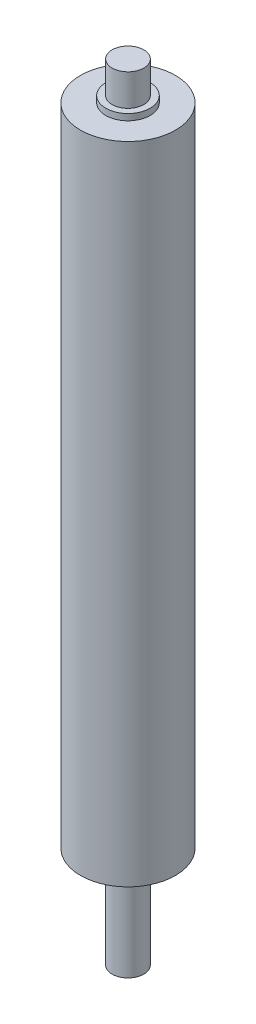
ISO-10303-21;
HEADER;
FILE_DESCRIPTION(('STEP AP214'),'2;1');
FILE_NAME('part.step','',(''),(''),'','','');
FILE_SCHEMA(('AUTOMOTIVE_DESIGN { 1 0 10303 214 1 1 1 1 }'));
ENDSEC;
DATA;
#1=APPLICATION_CONTEXT('core data for automotive mechanical design processes');
#2=APPLICATION_PROTOCOL_DEFINITION('international standard','automotive_design',2000,#1);
#3=PRODUCT_CONTEXT('',#1,'mechanical');
#4=PRODUCT('Part','Part','',(#3));
#5=PRODUCT_RELATED_PRODUCT_CATEGORY('part','',(#4));
#6=PRODUCT_DEFINITION_FORMATION('','',#4);
#7=PRODUCT_DEFINITION_CONTEXT('part definition',#1,'design');
#8=PRODUCT_DEFINITION('design','',#6,#7);
#9=PRODUCT_DEFINITION_SHAPE('','',#8);
#10=(LENGTH_UNIT() NAMED_UNIT(*) SI_UNIT(.MILLI.,.METRE.));
#11=(NAMED_UNIT(*) PLANE_ANGLE_UNIT() SI_UNIT($,.RADIAN.));
#12=(NAMED_UNIT(*) SI_UNIT($,.STERADIAN.) SOLID_ANGLE_UNIT());
#13=UNCERTAINTY_MEASURE_WITH_UNIT(LENGTH_MEASURE(1.E-05),#10,'distance_accuracy_value','');
#14=(GEOMETRIC_REPRESENTATION_CONTEXT(3) GLOBAL_UNCERTAINTY_ASSIGNED_CONTEXT((#13)) GLOBAL_UNIT_ASSIGNED_CONTEXT((#10,
#11,#12)) REPRESENTATION_CONTEXT('',''));
#15=CARTESIAN_POINT('',(0.,0.,0.));
#16=DIRECTION('',(0.,0.,1.));
#17=DIRECTION('',(1.,0.,0.));
#18=AXIS2_PLACEMENT_3D('',#15,#16,#17);
#19=CARTESIAN_POINT('',(0.,102.,0.));
#20=DIRECTION('',(0.,-1.,0.));
#21=DIRECTION('',(0.,0.,-1.));
#22=AXIS2_PLACEMENT_3D('',#19,#20,#21);
#23=CYLINDRICAL_SURFACE('',#22,7.5);
#24=CARTESIAN_POINT('',(0.,102.,0.));
#25=DIRECTION('',(0.,1.,0.));
#26=DIRECTION('',(0.,0.,1.));
#27=AXIS2_PLACEMENT_3D('',#24,#25,#26);
#28=CIRCLE('',#27,7.5);
#29=CARTESIAN_POINT('',(0.,102.,7.5));
#30=VERTEX_POINT('',#29);
#31=EDGE_CURVE('E65',#30,#30,#28,.T.);
#32=ORIENTED_EDGE('',*,*,#31,.F.);
#33=EDGE_LOOP('',(#32));
#34=FACE_BOUND('',#33,.T.);
#35=CARTESIAN_POINT('',(0.,0.,0.));
#36=DIRECTION('',(0.,1.,0.));
#37=DIRECTION('',(0.,0.,1.));
#38=AXIS2_PLACEMENT_3D('',#35,#36,#37);
#39=CIRCLE('',#38,7.5);
#40=CARTESIAN_POINT('',(0.,0.,7.5));
#41=VERTEX_POINT('',#40);
#42=EDGE_CURVE('E38',#41,#41,#39,.T.);
#43=ORIENTED_EDGE('',*,*,#42,.T.);
#44=EDGE_LOOP('',(#43));
#45=FACE_BOUND('',#44,.T.);
#46=ADVANCED_FACE('F35',(#34,#45),#23,.T.);
#47=CARTESIAN_POINT('',(0.,102.,0.));
#48=DIRECTION('',(0.,1.,0.));
#49=DIRECTION('',(0.,0.,1.));
#50=AXIS2_PLACEMENT_3D('',#47,#48,#49);
#51=PLANE('',#50);
#52=CARTESIAN_POINT('',(0.,102.,0.));
#53=DIRECTION('',(0.,1.,0.));
#54=DIRECTION('',(0.,0.,1.));
#55=AXIS2_PLACEMENT_3D('',#52,#53,#54);
#56=CIRCLE('',#55,3.5);
#57=CARTESIAN_POINT('',(0.,102.,3.5));
#58=VERTEX_POINT('',#57);
#59=EDGE_CURVE('E42',#58,#58,#56,.T.);
#60=ORIENTED_EDGE('',*,*,#59,.F.);
#61=EDGE_LOOP('',(#60));
#62=FACE_BOUND('',#61,.T.);
#63=ORIENTED_EDGE('',*,*,#31,.T.);
#64=EDGE_LOOP('',(#63));
#65=FACE_BOUND('',#64,.T.);
#66=ADVANCED_FACE('F76',(#62,#65),#51,.T.);
#67=CARTESIAN_POINT('',(0.,0.,0.));
#68=DIRECTION('',(0.,1.,0.));
#69=DIRECTION('',(0.,0.,1.));
#70=AXIS2_PLACEMENT_3D('',#67,#68,#69);
#71=PLANE('',#70);
#72=CARTESIAN_POINT('',(0.,0.,0.));
#73=DIRECTION('',(0.,-1.,0.));
#74=DIRECTION('',(0.,0.,-1.));
#75=AXIS2_PLACEMENT_3D('',#72,#73,#74);
#76=CIRCLE('',#75,3.5);
#77=CARTESIAN_POINT('',(0.,0.,-3.5));
#78=VERTEX_POINT('',#77);
#79=EDGE_CURVE('E61',#78,#78,#76,.T.);
#80=ORIENTED_EDGE('',*,*,#79,.F.);
#81=EDGE_LOOP('',(#80));
#82=FACE_BOUND('',#81,.T.);
#83=ORIENTED_EDGE('',*,*,#42,.F.);
#84=EDGE_LOOP('',(#83));
#85=FACE_BOUND('',#84,.T.);
#86=ADVANCED_FACE('F73',(#82,#85),#71,.F.);
#87=CARTESIAN_POINT('',(0.,-1.,0.));
#88=DIRECTION('',(0.,1.,0.));
#89=DIRECTION('',(0.,0.,1.));
#90=AXIS2_PLACEMENT_3D('',#87,#88,#89);
#91=CYLINDRICAL_SURFACE('',#90,3.5);
#92=CARTESIAN_POINT('',(0.,-1.,0.));
#93=DIRECTION('',(0.,-1.,0.));
#94=DIRECTION('',(0.,0.,-1.));
#95=AXIS2_PLACEMENT_3D('',#92,#93,#94);
#96=CIRCLE('',#95,3.5);
#97=CARTESIAN_POINT('',(0.,-1.,-3.5));
#98=VERTEX_POINT('',#97);
#99=EDGE_CURVE('E58',#98,#98,#96,.T.);
#100=ORIENTED_EDGE('',*,*,#99,.F.);
#101=EDGE_LOOP('',(#100));
#102=FACE_BOUND('',#101,.T.);
#103=ORIENTED_EDGE('',*,*,#79,.T.);
#104=EDGE_LOOP('',(#103));
#105=FACE_BOUND('',#104,.T.);
#106=ADVANCED_FACE('F75',(#102,#105),#91,.T.);
#107=CARTESIAN_POINT('',(0.,-1.,0.));
#108=DIRECTION('',(0.,-1.,0.));
#109=DIRECTION('',(0.,0.,-1.));
#110=AXIS2_PLACEMENT_3D('',#107,#108,#109);
#111=PLANE('',#110);
#112=CARTESIAN_POINT('',(0.,-1.,0.));
#113=DIRECTION('',(0.,-1.,0.));
#114=DIRECTION('',(0.,0.,-1.));
#115=AXIS2_PLACEMENT_3D('',#112,#113,#114);
#116=CIRCLE('',#115,2.5);
#117=CARTESIAN_POINT('',(0.,-1.,-2.5));
#118=VERTEX_POINT('',#117);
#119=EDGE_CURVE('E47',#118,#118,#116,.T.);
#120=ORIENTED_EDGE('',*,*,#119,.F.);
#121=EDGE_LOOP('',(#120));
#122=FACE_BOUND('',#121,.T.);
#123=ORIENTED_EDGE('',*,*,#99,.T.);
#124=EDGE_LOOP('',(#123));
#125=FACE_BOUND('',#124,.T.);
#126=ADVANCED_FACE('F82',(#122,#125),#111,.T.);
#127=CARTESIAN_POINT('',(0.,-16.,0.));
#128=DIRECTION('',(0.,1.,0.));
#129=DIRECTION('',(0.,0.,1.));
#130=AXIS2_PLACEMENT_3D('',#127,#128,#129);
#131=CYLINDRICAL_SURFACE('',#130,2.5);
#132=CARTESIAN_POINT('',(0.,-16.,0.));
#133=DIRECTION('',(0.,-1.,0.));
#134=DIRECTION('',(0.,0.,-1.));
#135=AXIS2_PLACEMENT_3D('',#132,#133,#134);
#136=CIRCLE('',#135,2.5);
#137=CARTESIAN_POINT('',(0.,-16.,-2.5));
#138=VERTEX_POINT('',#137);
#139=EDGE_CURVE('E54',#138,#138,#136,.T.);
#140=ORIENTED_EDGE('',*,*,#139,.F.);
#141=EDGE_LOOP('',(#140));
#142=FACE_BOUND('',#141,.T.);
#143=ORIENTED_EDGE('',*,*,#119,.T.);
#144=EDGE_LOOP('',(#143));
#145=FACE_BOUND('',#144,.T.);
#146=ADVANCED_FACE('F159',(#142,#145),#131,.T.);
#147=CARTESIAN_POINT('',(0.,-16.,0.));
#148=DIRECTION('',(0.,-1.,0.));
#149=DIRECTION('',(0.,0.,-1.));
#150=AXIS2_PLACEMENT_3D('',#147,#148,#149);
#151=PLANE('',#150);
#152=ORIENTED_EDGE('',*,*,#139,.T.);
#153=EDGE_LOOP('',(#152));
#154=FACE_BOUND('',#153,.T.);
#155=ADVANCED_FACE('F104',(#154),#151,.T.);
#156=CARTESIAN_POINT('',(0.,103.,0.));
#157=DIRECTION('',(0.,-1.,0.));
#158=DIRECTION('',(0.,0.,-1.));
#159=AXIS2_PLACEMENT_3D('',#156,#157,#158);
#160=CYLINDRICAL_SURFACE('',#159,3.5);
#161=CARTESIAN_POINT('',(0.,103.,0.));
#162=DIRECTION('',(0.,1.,0.));
#163=DIRECTION('',(0.,0.,1.));
#164=AXIS2_PLACEMENT_3D('',#161,#162,#163);
#165=CIRCLE('',#164,3.5);
#166=CARTESIAN_POINT('',(0.,103.,3.5));
#167=VERTEX_POINT('',#166);
#168=EDGE_CURVE('E52',#167,#167,#165,.T.);
#169=ORIENTED_EDGE('',*,*,#168,.F.);
#170=EDGE_LOOP('',(#169));
#171=FACE_BOUND('',#170,.T.);
#172=ORIENTED_EDGE('',*,*,#59,.T.);
#173=EDGE_LOOP('',(#172));
#174=FACE_BOUND('',#173,.T.);
#175=ADVANCED_FACE('F109',(#171,#174),#160,.T.);
#176=CARTESIAN_POINT('',(0.,103.,0.));
#177=DIRECTION('',(0.,1.,0.));
#178=DIRECTION('',(0.,0.,1.));
#179=AXIS2_PLACEMENT_3D('',#176,#177,#178);
#180=PLANE('',#179);
#181=CARTESIAN_POINT('',(0.,103.,0.));
#182=DIRECTION('',(0.,1.,0.));
#183=DIRECTION('',(0.,0.,1.));
#184=AXIS2_PLACEMENT_3D('',#181,#182,#183);
#185=CIRCLE('',#184,2.5);
#186=CARTESIAN_POINT('',(0.,103.,2.5));
#187=VERTEX_POINT('',#186);
#188=EDGE_CURVE('E10',#187,#187,#185,.T.);
#189=ORIENTED_EDGE('',*,*,#188,.F.);
#190=EDGE_LOOP('',(#189));
#191=FACE_BOUND('',#190,.T.);
#192=ORIENTED_EDGE('',*,*,#168,.T.);
#193=EDGE_LOOP('',(#192));
#194=FACE_BOUND('',#193,.T.);
#195=ADVANCED_FACE('F114',(#191,#194),#180,.T.);
#196=CARTESIAN_POINT('',(0.,108.,0.));
#197=DIRECTION('',(0.,-1.,0.));
#198=DIRECTION('',(0.,0.,-1.));
#199=AXIS2_PLACEMENT_3D('',#196,#197,#198);
#200=CYLINDRICAL_SURFACE('',#199,2.5);
#201=CARTESIAN_POINT('',(0.,108.,0.));
#202=DIRECTION('',(0.,1.,0.));
#203=DIRECTION('',(0.,0.,1.));
#204=AXIS2_PLACEMENT_3D('',#201,#202,#203);
#205=CIRCLE('',#204,2.5);
#206=CARTESIAN_POINT('',(0.,108.,2.5));
#207=VERTEX_POINT('',#206);
#208=EDGE_CURVE('E51',#207,#207,#205,.T.);
#209=ORIENTED_EDGE('',*,*,#208,.F.);
#210=EDGE_LOOP('',(#209));
#211=FACE_BOUND('',#210,.T.);
#212=ORIENTED_EDGE('',*,*,#188,.T.);
#213=EDGE_LOOP('',(#212));
#214=FACE_BOUND('',#213,.T.);
#215=ADVANCED_FACE('F125',(#211,#214),#200,.T.);
#216=CARTESIAN_POINT('',(0.,108.,0.));
#217=DIRECTION('',(0.,1.,0.));
#218=DIRECTION('',(0.,0.,1.));
#219=AXIS2_PLACEMENT_3D('',#216,#217,#218);
#220=PLANE('',#219);
#221=ORIENTED_EDGE('',*,*,#208,.T.);
#222=EDGE_LOOP('',(#221));
#223=FACE_BOUND('',#222,.T.);
#224=ADVANCED_FACE('F136',(#223),#220,.T.);
#225=CLOSED_SHELL('',(#46,#66,#86,#106,#126,#146,#155,#175,#195,#215,#224));
#226=MANIFOLD_SOLID_BREP('B2',#225);
#227=ADVANCED_BREP_SHAPE_REPRESENTATION('',(#18,#226),#14);
#228=SHAPE_DEFINITION_REPRESENTATION(#9,#227);
ENDSEC;
END-ISO-10303-21;
